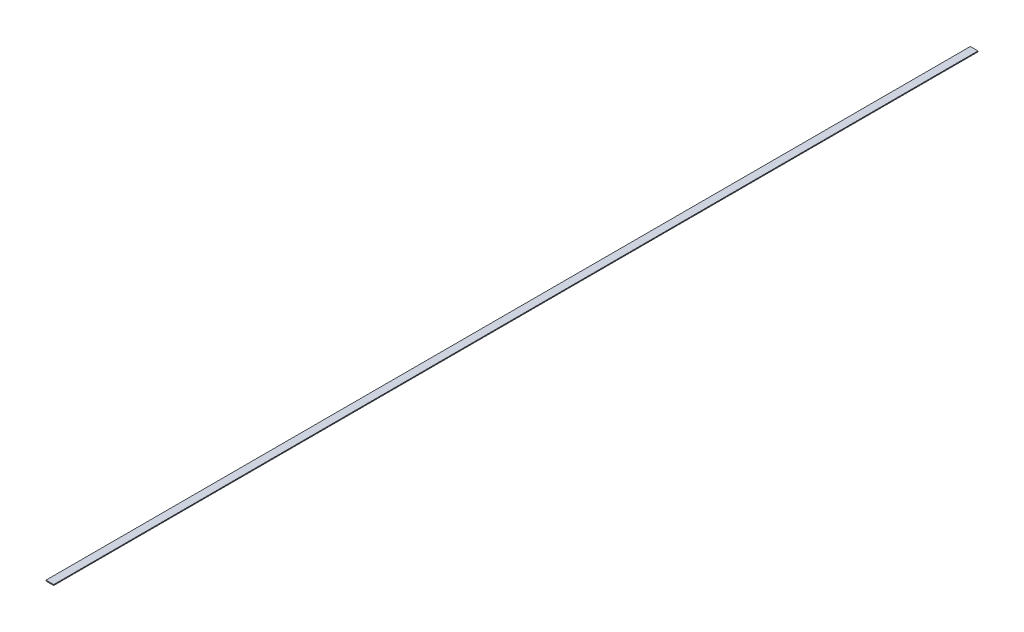
ISO-10303-21;
HEADER;
FILE_DESCRIPTION(('STEP AP214'),'2;1');
FILE_NAME('part.step','',(''),(''),'','','');
FILE_SCHEMA(('AUTOMOTIVE_DESIGN { 1 0 10303 214 1 1 1 1 }'));
ENDSEC;
DATA;
#1=APPLICATION_CONTEXT('core data for automotive mechanical design processes');
#2=APPLICATION_PROTOCOL_DEFINITION('international standard','automotive_design',2000,#1);
#3=PRODUCT_CONTEXT('',#1,'mechanical');
#4=PRODUCT('Part','Part','',(#3));
#5=PRODUCT_RELATED_PRODUCT_CATEGORY('part','',(#4));
#6=PRODUCT_DEFINITION_FORMATION('','',#4);
#7=PRODUCT_DEFINITION_CONTEXT('part definition',#1,'design');
#8=PRODUCT_DEFINITION('design','',#6,#7);
#9=PRODUCT_DEFINITION_SHAPE('','',#8);
#10=(LENGTH_UNIT() NAMED_UNIT(*) SI_UNIT(.MILLI.,.METRE.));
#11=(NAMED_UNIT(*) PLANE_ANGLE_UNIT() SI_UNIT($,.RADIAN.));
#12=(NAMED_UNIT(*) SI_UNIT($,.STERADIAN.) SOLID_ANGLE_UNIT());
#13=UNCERTAINTY_MEASURE_WITH_UNIT(LENGTH_MEASURE(1.E-05),#10,'distance_accuracy_value','');
#14=(GEOMETRIC_REPRESENTATION_CONTEXT(3) GLOBAL_UNCERTAINTY_ASSIGNED_CONTEXT((#13)) GLOBAL_UNIT_ASSIGNED_CONTEXT((#10,
#11,#12)) REPRESENTATION_CONTEXT('',''));
#15=CARTESIAN_POINT('',(0.,0.,0.));
#16=DIRECTION('',(0.,0.,1.));
#17=DIRECTION('',(1.,0.,0.));
#18=AXIS2_PLACEMENT_3D('',#15,#16,#17);
#19=CARTESIAN_POINT('',(6517.77653262708,4658.54454289602,1524.));
#20=DIRECTION('',(0.,-1.,0.));
#21=DIRECTION('',(0.,0.,-1.));
#22=AXIS2_PLACEMENT_3D('',#19,#20,#21);
#23=PLANE('',#22);
#24=DIRECTION('',(-1.,0.,0.));
#25=VECTOR('',#24,1.);
#26=CARTESIAN_POINT('',(6517.77653262708,4658.54454289602,0.));
#27=LINE('',#26,#25);
#28=CARTESIAN_POINT('',(6517.77653262708,4658.54454289602,0.));
#29=VERTEX_POINT('',#28);
#30=CARTESIAN_POINT('',(6505.07653262708,4658.54454289602,0.));
#31=VERTEX_POINT('',#30);
#32=EDGE_CURVE('E98',#29,#31,#27,.T.);
#33=ORIENTED_EDGE('',*,*,#32,.T.);
#34=DIRECTION('',(0.,0.,-1.));
#35=VECTOR('',#34,1.);
#36=CARTESIAN_POINT('',(6505.07653262708,4658.54454289602,1524.));
#37=LINE('',#36,#35);
#38=CARTESIAN_POINT('',(6505.07653262708,4658.54454289602,1524.));
#39=VERTEX_POINT('',#38);
#40=EDGE_CURVE('E11',#39,#31,#37,.T.);
#41=ORIENTED_EDGE('',*,*,#40,.F.);
#42=DIRECTION('',(-1.,0.,0.));
#43=VECTOR('',#42,1.);
#44=CARTESIAN_POINT('',(6517.77653262708,4658.54454289602,1524.));
#45=LINE('',#44,#43);
#46=CARTESIAN_POINT('',(6517.77653262708,4658.54454289602,1524.));
#47=VERTEX_POINT('',#46);
#48=EDGE_CURVE('E86',#47,#39,#45,.T.);
#49=ORIENTED_EDGE('',*,*,#48,.F.);
#50=DIRECTION('',(0.,0.,-1.));
#51=VECTOR('',#50,1.);
#52=CARTESIAN_POINT('',(6517.77653262708,4658.54454289602,1524.));
#53=LINE('',#52,#51);
#54=EDGE_CURVE('E94',#47,#29,#53,.T.);
#55=ORIENTED_EDGE('',*,*,#54,.T.);
#56=EDGE_LOOP('',(#33,#41,#49,#55));
#57=FACE_BOUND('',#56,.T.);
#58=ADVANCED_FACE('F35',(#57),#23,.F.);
#59=CARTESIAN_POINT('',(6505.07653262708,4658.54454289602,1524.));
#60=DIRECTION('',(1.,0.,0.));
#61=DIRECTION('',(0.,0.,-1.));
#62=AXIS2_PLACEMENT_3D('',#59,#60,#61);
#63=PLANE('',#62);
#64=DIRECTION('',(0.,-1.,0.));
#65=VECTOR('',#64,1.);
#66=CARTESIAN_POINT('',(6505.07653262708,4658.54454289602,0.));
#67=LINE('',#66,#65);
#68=CARTESIAN_POINT('',(6505.07653262708,4657.14754289602,0.));
#69=VERTEX_POINT('',#68);
#70=EDGE_CURVE('E90',#31,#69,#67,.T.);
#71=ORIENTED_EDGE('',*,*,#70,.T.);
#72=DIRECTION('',(0.,0.,-1.));
#73=VECTOR('',#72,1.);
#74=CARTESIAN_POINT('',(6505.07653262708,4657.14754289602,1524.));
#75=LINE('',#74,#73);
#76=CARTESIAN_POINT('',(6505.07653262708,4657.14754289602,1524.));
#77=VERTEX_POINT('',#76);
#78=EDGE_CURVE('E43',#77,#69,#75,.T.);
#79=ORIENTED_EDGE('',*,*,#78,.F.);
#80=DIRECTION('',(0.,-1.,0.));
#81=VECTOR('',#80,1.);
#82=CARTESIAN_POINT('',(6505.07653262708,4658.54454289602,1524.));
#83=LINE('',#82,#81);
#84=EDGE_CURVE('E81',#39,#77,#83,.T.);
#85=ORIENTED_EDGE('',*,*,#84,.F.);
#86=ORIENTED_EDGE('',*,*,#40,.T.);
#87=EDGE_LOOP('',(#71,#79,#85,#86));
#88=FACE_BOUND('',#87,.T.);
#89=ADVANCED_FACE('F89',(#88),#63,.F.);
#90=CARTESIAN_POINT('',(6517.77653262708,4657.14754289602,1524.));
#91=DIRECTION('',(0.,1.,0.));
#92=DIRECTION('',(0.,0.,1.));
#93=AXIS2_PLACEMENT_3D('',#90,#91,#92);
#94=PLANE('',#93);
#95=DIRECTION('',(1.,0.,0.));
#96=VECTOR('',#95,1.);
#97=CARTESIAN_POINT('',(6517.77653262708,4657.14754289602,0.));
#98=LINE('',#97,#96);
#99=CARTESIAN_POINT('',(6517.77653262708,4657.14754289602,0.));
#100=VERTEX_POINT('',#99);
#101=EDGE_CURVE('E68',#69,#100,#98,.T.);
#102=ORIENTED_EDGE('',*,*,#101,.T.);
#103=DIRECTION('',(0.,0.,-1.));
#104=VECTOR('',#103,1.);
#105=CARTESIAN_POINT('',(6517.77653262708,4657.14754289602,1524.));
#106=LINE('',#105,#104);
#107=CARTESIAN_POINT('',(6517.77653262708,4657.14754289602,1524.));
#108=VERTEX_POINT('',#107);
#109=EDGE_CURVE('E91',#108,#100,#106,.T.);
#110=ORIENTED_EDGE('',*,*,#109,.F.);
#111=DIRECTION('',(1.,0.,0.));
#112=VECTOR('',#111,1.);
#113=CARTESIAN_POINT('',(6517.77653262708,4657.14754289602,1524.));
#114=LINE('',#113,#112);
#115=EDGE_CURVE('E84',#77,#108,#114,.T.);
#116=ORIENTED_EDGE('',*,*,#115,.F.);
#117=ORIENTED_EDGE('',*,*,#78,.T.);
#118=EDGE_LOOP('',(#102,#110,#116,#117));
#119=FACE_BOUND('',#118,.T.);
#120=ADVANCED_FACE('F92',(#119),#94,.F.);
#121=CARTESIAN_POINT('',(6517.77653262708,4658.54454289602,1524.));
#122=DIRECTION('',(-1.,0.,0.));
#123=DIRECTION('',(0.,0.,1.));
#124=AXIS2_PLACEMENT_3D('',#121,#122,#123);
#125=PLANE('',#124);
#126=DIRECTION('',(0.,1.,0.));
#127=VECTOR('',#126,1.);
#128=CARTESIAN_POINT('',(6517.77653262708,4658.54454289602,0.));
#129=LINE('',#128,#127);
#130=EDGE_CURVE('E74',#100,#29,#129,.T.);
#131=ORIENTED_EDGE('',*,*,#130,.T.);
#132=ORIENTED_EDGE('',*,*,#54,.F.);
#133=DIRECTION('',(0.,1.,0.));
#134=VECTOR('',#133,1.);
#135=CARTESIAN_POINT('',(6517.77653262708,4658.54454289602,1524.));
#136=LINE('',#135,#134);
#137=EDGE_CURVE('E51',#108,#47,#136,.T.);
#138=ORIENTED_EDGE('',*,*,#137,.F.);
#139=ORIENTED_EDGE('',*,*,#109,.T.);
#140=EDGE_LOOP('',(#131,#132,#138,#139));
#141=FACE_BOUND('',#140,.T.);
#142=ADVANCED_FACE('F105',(#141),#125,.F.);
#143=CARTESIAN_POINT('',(0.,0.,1524.));
#144=DIRECTION('',(0.,0.,1.));
#145=DIRECTION('',(1.,0.,0.));
#146=AXIS2_PLACEMENT_3D('',#143,#144,#145);
#147=PLANE('',#146);
#148=ORIENTED_EDGE('',*,*,#48,.T.);
#149=ORIENTED_EDGE('',*,*,#84,.T.);
#150=ORIENTED_EDGE('',*,*,#115,.T.);
#151=ORIENTED_EDGE('',*,*,#137,.T.);
#152=EDGE_LOOP('',(#148,#149,#150,#151));
#153=FACE_BOUND('',#152,.T.);
#154=ADVANCED_FACE('F82',(#153),#147,.T.);
#155=CARTESIAN_POINT('',(0.,0.,0.));
#156=DIRECTION('',(0.,0.,1.));
#157=DIRECTION('',(1.,0.,0.));
#158=AXIS2_PLACEMENT_3D('',#155,#156,#157);
#159=PLANE('',#158);
#160=ORIENTED_EDGE('',*,*,#32,.F.);
#161=ORIENTED_EDGE('',*,*,#130,.F.);
#162=ORIENTED_EDGE('',*,*,#101,.F.);
#163=ORIENTED_EDGE('',*,*,#70,.F.);
#164=EDGE_LOOP('',(#160,#161,#162,#163));
#165=FACE_BOUND('',#164,.T.);
#166=ADVANCED_FACE('F108',(#165),#159,.F.);
#167=CLOSED_SHELL('',(#58,#89,#120,#142,#154,#166));
#168=MANIFOLD_SOLID_BREP('B2',#167);
#169=ADVANCED_BREP_SHAPE_REPRESENTATION('',(#18,#168),#14);
#170=SHAPE_DEFINITION_REPRESENTATION(#9,#169);
ENDSEC;
END-ISO-10303-21;
